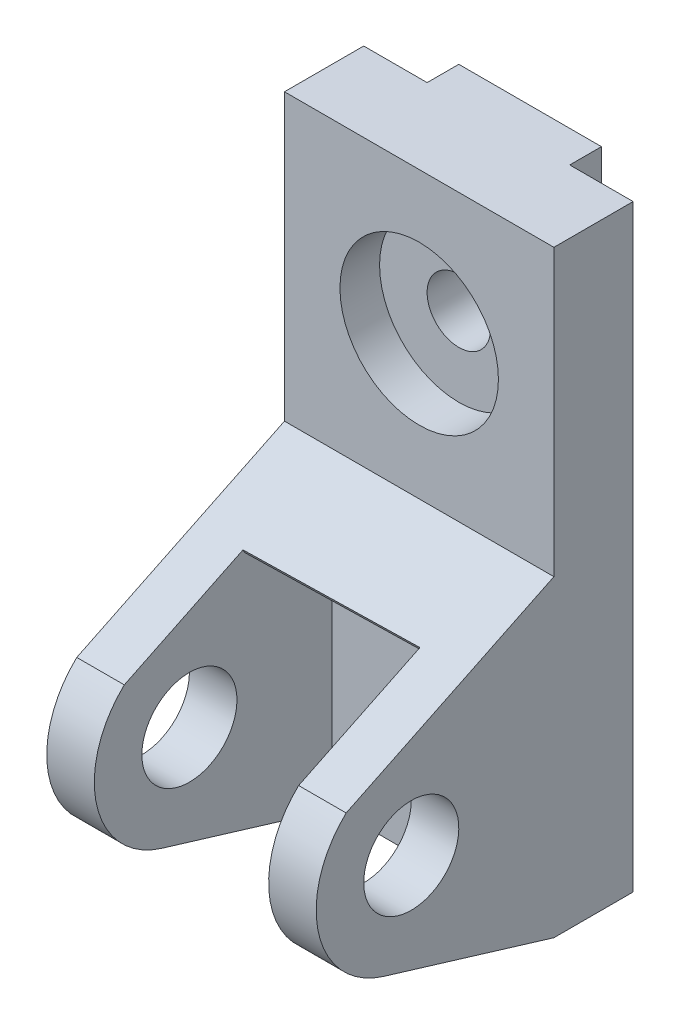
ISO-10303-21;
HEADER;
FILE_DESCRIPTION(('STEP AP214'),'2;1');
FILE_NAME('part.step','',(''),(''),'','','');
FILE_SCHEMA(('AUTOMOTIVE_DESIGN { 1 0 10303 214 1 1 1 1 }'));
ENDSEC;
DATA;
#1=APPLICATION_CONTEXT('core data for automotive mechanical design processes');
#2=APPLICATION_PROTOCOL_DEFINITION('international standard','automotive_design',2000,#1);
#3=PRODUCT_CONTEXT('',#1,'mechanical');
#4=PRODUCT('Part','Part','',(#3));
#5=PRODUCT_RELATED_PRODUCT_CATEGORY('part','',(#4));
#6=PRODUCT_DEFINITION_FORMATION('','',#4);
#7=PRODUCT_DEFINITION_CONTEXT('part definition',#1,'design');
#8=PRODUCT_DEFINITION('design','',#6,#7);
#9=PRODUCT_DEFINITION_SHAPE('','',#8);
#10=(LENGTH_UNIT() NAMED_UNIT(*) SI_UNIT(.MILLI.,.METRE.));
#11=(NAMED_UNIT(*) PLANE_ANGLE_UNIT() SI_UNIT($,.RADIAN.));
#12=(NAMED_UNIT(*) SI_UNIT($,.STERADIAN.) SOLID_ANGLE_UNIT());
#13=UNCERTAINTY_MEASURE_WITH_UNIT(LENGTH_MEASURE(1.E-05),#10,'distance_accuracy_value','');
#14=(GEOMETRIC_REPRESENTATION_CONTEXT(3) GLOBAL_UNCERTAINTY_ASSIGNED_CONTEXT((#13)) GLOBAL_UNIT_ASSIGNED_CONTEXT((#10,
#11,#12)) REPRESENTATION_CONTEXT('',''));
#15=CARTESIAN_POINT('',(0.,0.,0.));
#16=DIRECTION('',(0.,0.,1.));
#17=DIRECTION('',(1.,0.,0.));
#18=AXIS2_PLACEMENT_3D('',#15,#16,#17);
#19=CARTESIAN_POINT('',(-7.65235457063711,0.,-25.));
#20=DIRECTION('',(0.,0.,1.));
#21=DIRECTION('',(1.,0.,0.));
#22=AXIS2_PLACEMENT_3D('',#19,#20,#21);
#23=CYLINDRICAL_SURFACE('',#22,10.);
#24=CARTESIAN_POINT('',(-7.65235457063711,0.,-25.));
#25=DIRECTION('',(0.,0.,1.));
#26=DIRECTION('',(1.,0.,0.));
#27=AXIS2_PLACEMENT_3D('',#24,#25,#26);
#28=CIRCLE('',#27,10.);
#29=CARTESIAN_POINT('',(2.34764542936289,0.,-25.));
#30=VERTEX_POINT('',#29);
#31=EDGE_CURVE('E43',#30,#30,#28,.T.);
#32=ORIENTED_EDGE('',*,*,#31,.F.);
#33=EDGE_LOOP('',(#32));
#34=FACE_BOUND('',#33,.T.);
#35=CARTESIAN_POINT('',(-7.65235457063711,0.,-12.5));
#36=DIRECTION('',(0.,0.,1.));
#37=DIRECTION('',(1.,0.,0.));
#38=AXIS2_PLACEMENT_3D('',#35,#36,#37);
#39=CIRCLE('',#38,10.);
#40=CARTESIAN_POINT('',(2.34764542936289,0.,-12.5));
#41=VERTEX_POINT('',#40);
#42=EDGE_CURVE('E82',#41,#41,#39,.T.);
#43=ORIENTED_EDGE('',*,*,#42,.T.);
#44=EDGE_LOOP('',(#43));
#45=FACE_BOUND('',#44,.T.);
#46=ADVANCED_FACE('F39',(#34,#45),#23,.F.);
#47=CARTESIAN_POINT('',(0.,0.,-12.5));
#48=DIRECTION('',(0.,0.,1.));
#49=DIRECTION('',(1.,0.,0.));
#50=AXIS2_PLACEMENT_3D('',#47,#48,#49);
#51=PLANE('',#50);
#52=ORIENTED_EDGE('',*,*,#42,.F.);
#53=EDGE_LOOP('',(#52));
#54=FACE_BOUND('',#53,.T.);
#55=CARTESIAN_POINT('',(-7.65235457063711,0.,-12.5));
#56=DIRECTION('',(0.,0.,1.));
#57=DIRECTION('',(1.,0.,0.));
#58=AXIS2_PLACEMENT_3D('',#55,#56,#57);
#59=CIRCLE('',#58,25.);
#60=CARTESIAN_POINT('',(17.3476454293629,0.,-12.5));
#61=VERTEX_POINT('',#60);
#62=EDGE_CURVE('E372',#61,#61,#59,.T.);
#63=ORIENTED_EDGE('',*,*,#62,.T.);
#64=EDGE_LOOP('',(#63));
#65=FACE_BOUND('',#64,.T.);
#66=ADVANCED_FACE('F112',(#54,#65),#51,.T.);
#67=CARTESIAN_POINT('',(14.8476454293629,-143.145429362881,-25.));
#68=DIRECTION('',(0.,0.,1.));
#69=DIRECTION('',(1.,0.,0.));
#70=AXIS2_PLACEMENT_3D('',#67,#68,#69);
#71=PLANE('',#70);
#72=ORIENTED_EDGE('',*,*,#31,.T.);
#73=EDGE_LOOP('',(#72));
#74=FACE_BOUND('',#73,.T.);
#75=ADVANCED_FACE('F109',(#74),#71,.T.);
#76=CARTESIAN_POINT('',(0.,0.,0.));
#77=DIRECTION('',(0.,0.,1.));
#78=DIRECTION('',(1.,0.,0.));
#79=AXIS2_PLACEMENT_3D('',#76,#77,#78);
#80=PLANE('',#79);
#81=CARTESIAN_POINT('',(-7.65235457063711,0.,0.));
#82=DIRECTION('',(0.,0.,1.));
#83=DIRECTION('',(1.,0.,0.));
#84=AXIS2_PLACEMENT_3D('',#81,#82,#83);
#85=CIRCLE('',#84,25.);
#86=CARTESIAN_POINT('',(17.3476454293629,0.,0.));
#87=VERTEX_POINT('',#86);
#88=EDGE_CURVE('E326',#87,#87,#85,.T.);
#89=ORIENTED_EDGE('',*,*,#88,.F.);
#90=EDGE_LOOP('',(#89));
#91=FACE_BOUND('',#90,.T.);
#92=DIRECTION('',(0.,1.,0.));
#93=VECTOR('',#92,1.);
#94=CARTESIAN_POINT('',(-50.1523545706371,0.,0.));
#95=LINE('',#94,#93);
#96=CARTESIAN_POINT('',(-50.1523545706371,-45.1454293628809,0.));
#97=VERTEX_POINT('',#96);
#98=CARTESIAN_POINT('',(-50.1523545706371,44.8545706371191,0.));
#99=VERTEX_POINT('',#98);
#100=EDGE_CURVE('E339',#97,#99,#95,.T.);
#101=ORIENTED_EDGE('',*,*,#100,.F.);
#102=DIRECTION('',(-1.,0.,0.));
#103=VECTOR('',#102,1.);
#104=CARTESIAN_POINT('',(0.,-45.1454293628809,0.));
#105=LINE('',#104,#103);
#106=CARTESIAN_POINT('',(34.8476454293629,-45.1454293628809,0.));
#107=VERTEX_POINT('',#106);
#108=EDGE_CURVE('E348',#107,#97,#105,.T.);
#109=ORIENTED_EDGE('',*,*,#108,.F.);
#110=DIRECTION('',(0.,-1.,0.));
#111=VECTOR('',#110,1.);
#112=CARTESIAN_POINT('',(34.8476454293629,0.,0.));
#113=LINE('',#112,#111);
#114=CARTESIAN_POINT('',(34.8476454293629,44.8545706371191,0.));
#115=VERTEX_POINT('',#114);
#116=EDGE_CURVE('E351',#115,#107,#113,.T.);
#117=ORIENTED_EDGE('',*,*,#116,.F.);
#118=DIRECTION('',(1.,0.,0.));
#119=VECTOR('',#118,1.);
#120=CARTESIAN_POINT('',(0.,44.8545706371191,0.));
#121=LINE('',#120,#119);
#122=EDGE_CURVE('E354',#99,#115,#121,.T.);
#123=ORIENTED_EDGE('',*,*,#122,.F.);
#124=EDGE_LOOP('',(#101,#109,#117,#123));
#125=FACE_BOUND('',#124,.T.);
#126=ADVANCED_FACE('F121',(#91,#125),#80,.T.);
#127=DIRECTION('',(1.,0.,0.));
#128=VECTOR('',#127,1.);
#129=CARTESIAN_POINT('',(0.,-46.2568685076262,0.));
#130=LINE('',#129,#128);
#131=CARTESIAN_POINT('',(-35.1523545706371,-46.2568685076262,0.));
#132=VERTEX_POINT('',#131);
#133=CARTESIAN_POINT('',(19.8476454293629,-46.2568685076262,0.));
#134=VERTEX_POINT('',#133);
#135=EDGE_CURVE('E216',#132,#134,#130,.T.);
#136=ORIENTED_EDGE('',*,*,#135,.F.);
#137=DIRECTION('',(0.,1.,0.));
#138=VECTOR('',#137,1.);
#139=CARTESIAN_POINT('',(-35.1523545706371,-45.1454293628809,0.));
#140=LINE('',#139,#138);
#141=CARTESIAN_POINT('',(-35.1523545706371,-143.145429362881,0.));
#142=VERTEX_POINT('',#141);
#143=EDGE_CURVE('E243',#142,#132,#140,.T.);
#144=ORIENTED_EDGE('',*,*,#143,.F.);
#145=DIRECTION('',(-1.,0.,0.));
#146=VECTOR('',#145,1.);
#147=CARTESIAN_POINT('',(-50.1523545706371,-143.145429362881,0.));
#148=LINE('',#147,#146);
#149=CARTESIAN_POINT('',(19.8476454293629,-143.145429362881,0.));
#150=VERTEX_POINT('',#149);
#151=EDGE_CURVE('E283',#150,#142,#148,.T.);
#152=ORIENTED_EDGE('',*,*,#151,.F.);
#153=DIRECTION('',(0.,1.,0.));
#154=VECTOR('',#153,1.);
#155=CARTESIAN_POINT('',(19.8476454293629,0.,0.));
#156=LINE('',#155,#154);
#157=EDGE_CURVE('E367',#150,#134,#156,.T.);
#158=ORIENTED_EDGE('',*,*,#157,.T.);
#159=EDGE_LOOP('',(#136,#144,#152,#158));
#160=FACE_BOUND('',#159,.T.);
#161=ADVANCED_FACE('F150',(#160),#80,.T.);
#162=CARTESIAN_POINT('',(19.8476454293629,0.,0.));
#163=DIRECTION('',(1.,0.,0.));
#164=DIRECTION('',(0.,1.,0.));
#165=AXIS2_PLACEMENT_3D('',#162,#163,#164);
#166=PLANE('',#165);
#167=CARTESIAN_POINT('',(19.8476454293629,-98.8027621053321,45.));
#168=DIRECTION('',(1.,0.,0.));
#169=DIRECTION('',(0.,1.,0.));
#170=AXIS2_PLACEMENT_3D('',#167,#168,#169);
#171=CIRCLE('',#170,15.);
#172=CARTESIAN_POINT('',(19.8476454293629,-83.8027621053321,45.));
#173=VERTEX_POINT('',#172);
#174=EDGE_CURVE('E290',#173,#173,#171,.T.);
#175=ORIENTED_EDGE('',*,*,#174,.T.);
#176=EDGE_LOOP('',(#175));
#177=FACE_BOUND('',#176,.T.);
#178=DIRECTION('',(0.,-0.436437923788703,0.899734371177964));
#179=VECTOR('',#178,1.);
#180=CARTESIAN_POINT('',(19.8476454293629,-36.5462155003355,-17.7276259818978));
#181=LINE('',#180,#179);
#182=CARTESIAN_POINT('',(19.8476454293629,-58.3726068665543,27.2683595651249));
#183=VERTEX_POINT('',#182);
#184=CARTESIAN_POINT('',(19.8476454293629,-76.9373199425125,65.5402638499214));
#185=VERTEX_POINT('',#184);
#186=EDGE_CURVE('E293',#183,#185,#181,.T.);
#187=ORIENTED_EDGE('',*,*,#186,.F.);
#188=DIRECTION('',(0.,-0.899734371177964,-0.436437923788703));
#189=VECTOR('',#188,1.);
#190=CARTESIAN_POINT('',(19.8476454293629,-21.8263913662188,44.9959855470227));
#191=LINE('',#190,#189);
#192=CARTESIAN_POINT('',(19.8476454293629,-59.2723412377323,26.8319216413362));
#193=VERTEX_POINT('',#192);
#194=EDGE_CURVE('E228',#183,#193,#191,.T.);
#195=ORIENTED_EDGE('',*,*,#194,.T.);
#196=DIRECTION('',(0.,0.436437923788703,-0.899734371177964));
#197=VECTOR('',#196,1.);
#198=CARTESIAN_POINT('',(19.8476454293629,-37.4459498715134,-18.1640639056865));
#199=LINE('',#198,#197);
#200=EDGE_CURVE('E209',#193,#134,#199,.T.);
#201=ORIENTED_EDGE('',*,*,#200,.T.);
#202=ORIENTED_EDGE('',*,*,#157,.F.);
#203=DIRECTION('',(0.,0.,1.));
#204=VECTOR('',#203,1.);
#205=CARTESIAN_POINT('',(19.8476454293629,-143.145429362881,0.));
#206=LINE('',#205,#204);
#207=CARTESIAN_POINT('',(19.8476454293629,-143.145429362881,-25.));
#208=VERTEX_POINT('',#207);
#209=EDGE_CURVE('E362',#208,#150,#206,.T.);
#210=ORIENTED_EDGE('',*,*,#209,.F.);
#211=DIRECTION('',(0.,-1.,0.));
#212=VECTOR('',#211,1.);
#213=CARTESIAN_POINT('',(19.8476454293629,0.,-25.));
#214=LINE('',#213,#212);
#215=CARTESIAN_POINT('',(19.8476454293629,-143.802762105332,-25.));
#216=VERTEX_POINT('',#215);
#217=EDGE_CURVE('E306',#208,#216,#214,.T.);
#218=ORIENTED_EDGE('',*,*,#217,.T.);
#219=DIRECTION('',(0.,0.,1.));
#220=VECTOR('',#219,1.);
#221=CARTESIAN_POINT('',(19.8476454293629,-143.802762105332,0.));
#222=LINE('',#221,#220);
#223=CARTESIAN_POINT('',(19.8476454293629,-143.802762105332,0.));
#224=VERTEX_POINT('',#223);
#225=EDGE_CURVE('E303',#216,#224,#222,.T.);
#226=ORIENTED_EDGE('',*,*,#225,.T.);
#227=DIRECTION('',(0.,-0.290276231128989,-0.956942897795657));
#228=VECTOR('',#227,1.);
#229=CARTESIAN_POINT('',(19.8476454293629,-131.68589961599,39.9452116959255));
#230=LINE('',#229,#228);
#231=CARTESIAN_POINT('',(19.8476454293629,-127.511049039202,53.7082869338697));
#232=VERTEX_POINT('',#231);
#233=EDGE_CURVE('E300',#232,#224,#230,.T.);
#234=ORIENTED_EDGE('',*,*,#233,.F.);
#235=CARTESIAN_POINT('',(19.8476454293629,-98.8027621053321,45.));
#236=DIRECTION('',(1.,0.,0.));
#237=DIRECTION('',(0.,1.,0.));
#238=AXIS2_PLACEMENT_3D('',#235,#236,#237);
#239=CIRCLE('',#238,30.);
#240=EDGE_CURVE('E297',#185,#232,#239,.T.);
#241=ORIENTED_EDGE('',*,*,#240,.F.);
#242=EDGE_LOOP('',(#187,#195,#201,#202,#210,#218,#226,#234,#241));
#243=FACE_BOUND('',#242,.T.);
#244=ADVANCED_FACE('F148',(#177,#243),#166,.F.);
#245=CARTESIAN_POINT('',(-50.1523545706371,0.,-25.));
#246=DIRECTION('',(1.,0.,0.));
#247=DIRECTION('',(0.,0.,-1.));
#248=AXIS2_PLACEMENT_3D('',#245,#246,#247);
#249=PLANE('',#248);
#250=DIRECTION('',(0.,-0.436437923788703,0.899734371177964));
#251=VECTOR('',#250,1.);
#252=CARTESIAN_POINT('',(-50.1523545706371,-36.5462155003355,-17.7276259818978));
#253=LINE('',#252,#251);
#254=CARTESIAN_POINT('',(-50.1523545706371,-76.9373199425125,65.5402638499214));
#255=VERTEX_POINT('',#254);
#256=EDGE_CURVE('E262',#97,#255,#253,.T.);
#257=ORIENTED_EDGE('',*,*,#256,.F.);
#258=ORIENTED_EDGE('',*,*,#100,.T.);
#259=DIRECTION('',(0.,0.,1.));
#260=VECTOR('',#259,1.);
#261=CARTESIAN_POINT('',(-50.1523545706371,44.8545706371191,-25.));
#262=LINE('',#261,#260);
#263=CARTESIAN_POINT('',(-50.1523545706371,44.8545706371191,-25.));
#264=VERTEX_POINT('',#263);
#265=EDGE_CURVE('E359',#264,#99,#262,.T.);
#266=ORIENTED_EDGE('',*,*,#265,.F.);
#267=DIRECTION('',(0.,1.,0.));
#268=VECTOR('',#267,1.);
#269=CARTESIAN_POINT('',(-50.1523545706371,0.,-25.));
#270=LINE('',#269,#268);
#271=CARTESIAN_POINT('',(-50.1523545706371,-143.145429362881,-25.));
#272=VERTEX_POINT('',#271);
#273=EDGE_CURVE('E342',#272,#264,#270,.T.);
#274=ORIENTED_EDGE('',*,*,#273,.F.);
#275=DIRECTION('',(0.,0.,-1.));
#276=VECTOR('',#275,1.);
#277=CARTESIAN_POINT('',(-50.1523545706371,-143.145429362881,-25.));
#278=LINE('',#277,#276);
#279=CARTESIAN_POINT('',(-50.1523545706371,-143.145429362881,0.));
#280=VERTEX_POINT('',#279);
#281=EDGE_CURVE('E286',#280,#272,#278,.T.);
#282=ORIENTED_EDGE('',*,*,#281,.F.);
#283=DIRECTION('',(0.,1.,0.));
#284=VECTOR('',#283,1.);
#285=CARTESIAN_POINT('',(-50.1523545706371,-45.1454293628809,0.));
#286=LINE('',#285,#284);
#287=CARTESIAN_POINT('',(-50.1523545706371,-143.802762105332,0.));
#288=VERTEX_POINT('',#287);
#289=EDGE_CURVE('E222',#288,#280,#286,.T.);
#290=ORIENTED_EDGE('',*,*,#289,.F.);
#291=DIRECTION('',(0.,-0.290276231128989,-0.956942897795657));
#292=VECTOR('',#291,1.);
#293=CARTESIAN_POINT('',(-50.1523545706371,-131.68589961599,39.9452116959255));
#294=LINE('',#293,#292);
#295=CARTESIAN_POINT('',(-50.1523545706371,-127.511049039202,53.7082869338697));
#296=VERTEX_POINT('',#295);
#297=EDGE_CURVE('E250',#296,#288,#294,.T.);
#298=ORIENTED_EDGE('',*,*,#297,.F.);
#299=CARTESIAN_POINT('',(-50.1523545706371,-98.8027621053321,45.));
#300=DIRECTION('',(1.,0.,0.));
#301=DIRECTION('',(0.,1.,0.));
#302=AXIS2_PLACEMENT_3D('',#299,#300,#301);
#303=CIRCLE('',#302,30.);
#304=EDGE_CURVE('E265',#255,#296,#303,.T.);
#305=ORIENTED_EDGE('',*,*,#304,.F.);
#306=EDGE_LOOP('',(#257,#258,#266,#274,#282,#290,#298,#305));
#307=FACE_BOUND('',#306,.T.);
#308=CARTESIAN_POINT('',(-50.1523545706371,-98.8027621053321,45.));
#309=DIRECTION('',(1.,0.,0.));
#310=DIRECTION('',(0.,1.,0.));
#311=AXIS2_PLACEMENT_3D('',#308,#309,#310);
#312=CIRCLE('',#311,15.);
#313=CARTESIAN_POINT('',(-50.1523545706371,-83.8027621053321,45.));
#314=VERTEX_POINT('',#313);
#315=EDGE_CURVE('E242',#314,#314,#312,.T.);
#316=ORIENTED_EDGE('',*,*,#315,.T.);
#317=EDGE_LOOP('',(#316));
#318=FACE_BOUND('',#317,.T.);
#319=ADVANCED_FACE('F140',(#307,#318),#249,.F.);
#320=CARTESIAN_POINT('',(-7.65235457063711,0.,-25.));
#321=DIRECTION('',(0.,0.,1.));
#322=DIRECTION('',(1.,0.,0.));
#323=AXIS2_PLACEMENT_3D('',#320,#321,#322);
#324=CYLINDRICAL_SURFACE('',#323,25.);
#325=ORIENTED_EDGE('',*,*,#62,.F.);
#326=EDGE_LOOP('',(#325));
#327=FACE_BOUND('',#326,.T.);
#328=ORIENTED_EDGE('',*,*,#88,.T.);
#329=EDGE_LOOP('',(#328));
#330=FACE_BOUND('',#329,.T.);
#331=ADVANCED_FACE('F136',(#327,#330),#324,.F.);
#332=CARTESIAN_POINT('',(34.8476454293629,0.,-25.));
#333=DIRECTION('',(-1.,0.,0.));
#334=DIRECTION('',(0.,-1.,0.));
#335=AXIS2_PLACEMENT_3D('',#332,#333,#334);
#336=PLANE('',#335);
#337=DIRECTION('',(0.,-0.436437923788703,0.899734371177964));
#338=VECTOR('',#337,1.);
#339=CARTESIAN_POINT('',(34.8476454293629,-36.5462155003355,-17.7276259818978));
#340=LINE('',#339,#338);
#341=CARTESIAN_POINT('',(34.8476454293629,-76.9373199425125,65.5402638499214));
#342=VERTEX_POINT('',#341);
#343=EDGE_CURVE('E312',#107,#342,#340,.T.);
#344=ORIENTED_EDGE('',*,*,#343,.T.);
#345=CARTESIAN_POINT('',(34.8476454293629,-98.8027621053321,45.));
#346=DIRECTION('',(1.,0.,0.));
#347=DIRECTION('',(0.,1.,0.));
#348=AXIS2_PLACEMENT_3D('',#345,#346,#347);
#349=CIRCLE('',#348,30.);
#350=CARTESIAN_POINT('',(34.8476454293629,-127.511049039202,53.7082869338697));
#351=VERTEX_POINT('',#350);
#352=EDGE_CURVE('E315',#342,#351,#349,.T.);
#353=ORIENTED_EDGE('',*,*,#352,.T.);
#354=DIRECTION('',(0.,-0.290276231128989,-0.956942897795657));
#355=VECTOR('',#354,1.);
#356=CARTESIAN_POINT('',(34.8476454293629,-131.68589961599,39.9452116959255));
#357=LINE('',#356,#355);
#358=CARTESIAN_POINT('',(34.8476454293629,-143.802762105332,0.));
#359=VERTEX_POINT('',#358);
#360=EDGE_CURVE('E318',#351,#359,#357,.T.);
#361=ORIENTED_EDGE('',*,*,#360,.T.);
#362=DIRECTION('',(0.,0.,1.));
#363=VECTOR('',#362,1.);
#364=CARTESIAN_POINT('',(34.8476454293629,-143.802762105332,0.));
#365=LINE('',#364,#363);
#366=CARTESIAN_POINT('',(34.8476454293629,-143.802762105332,-25.));
#367=VERTEX_POINT('',#366);
#368=EDGE_CURVE('E294',#367,#359,#365,.T.);
#369=ORIENTED_EDGE('',*,*,#368,.F.);
#370=DIRECTION('',(0.,-1.,0.));
#371=VECTOR('',#370,1.);
#372=CARTESIAN_POINT('',(34.8476454293629,0.,-25.));
#373=LINE('',#372,#371);
#374=CARTESIAN_POINT('',(34.8476454293629,44.8545706371191,-25.));
#375=VERTEX_POINT('',#374);
#376=EDGE_CURVE('E335',#375,#367,#373,.T.);
#377=ORIENTED_EDGE('',*,*,#376,.F.);
#378=DIRECTION('',(0.,0.,1.));
#379=VECTOR('',#378,1.);
#380=CARTESIAN_POINT('',(34.8476454293629,44.8545706371191,-25.));
#381=LINE('',#380,#379);
#382=EDGE_CURVE('E345',#375,#115,#381,.T.);
#383=ORIENTED_EDGE('',*,*,#382,.T.);
#384=ORIENTED_EDGE('',*,*,#116,.T.);
#385=EDGE_LOOP('',(#344,#353,#361,#369,#377,#383,#384));
#386=FACE_BOUND('',#385,.T.);
#387=CARTESIAN_POINT('',(34.8476454293629,-98.8027621053321,45.));
#388=DIRECTION('',(1.,0.,0.));
#389=DIRECTION('',(0.,1.,0.));
#390=AXIS2_PLACEMENT_3D('',#387,#388,#389);
#391=CIRCLE('',#390,15.);
#392=CARTESIAN_POINT('',(34.8476454293629,-83.8027621053321,45.));
#393=VERTEX_POINT('',#392);
#394=EDGE_CURVE('E289',#393,#393,#391,.T.);
#395=ORIENTED_EDGE('',*,*,#394,.F.);
#396=EDGE_LOOP('',(#395));
#397=FACE_BOUND('',#396,.T.);
#398=ADVANCED_FACE('F139',(#386,#397),#336,.F.);
#399=CARTESIAN_POINT('',(19.8476454293629,-36.5462155003355,-17.7276259818978));
#400=DIRECTION('',(0.,0.899734371177964,0.436437923788703));
#401=DIRECTION('',(0.,-0.436437923788703,0.899734371177964));
#402=AXIS2_PLACEMENT_3D('',#399,#400,#401);
#403=PLANE('',#402);
#404=DIRECTION('',(1.,0.,0.));
#405=VECTOR('',#404,1.);
#406=CARTESIAN_POINT('',(19.8476454293629,-76.9373199425125,65.5402638499214));
#407=LINE('',#406,#405);
#408=EDGE_CURVE('E309',#185,#342,#407,.T.);
#409=ORIENTED_EDGE('',*,*,#408,.T.);
#410=ORIENTED_EDGE('',*,*,#343,.F.);
#411=ORIENTED_EDGE('',*,*,#108,.T.);
#412=ORIENTED_EDGE('',*,*,#256,.T.);
#413=DIRECTION('',(-1.,0.,0.));
#414=VECTOR('',#413,1.);
#415=CARTESIAN_POINT('',(-35.1523545706371,-76.9373199425125,65.5402638499214));
#416=LINE('',#415,#414);
#417=CARTESIAN_POINT('',(-35.1523545706371,-76.9373199425125,65.5402638499214));
#418=VERTEX_POINT('',#417);
#419=EDGE_CURVE('E259',#418,#255,#416,.T.);
#420=ORIENTED_EDGE('',*,*,#419,.F.);
#421=DIRECTION('',(0.,-0.436437923788703,0.899734371177964));
#422=VECTOR('',#421,1.);
#423=CARTESIAN_POINT('',(-35.1523545706371,-36.5462155003355,-17.7276259818978));
#424=LINE('',#423,#422);
#425=CARTESIAN_POINT('',(-35.1523545706371,-58.7718459329056,28.0914069923396));
#426=VERTEX_POINT('',#425);
#427=EDGE_CURVE('E249',#426,#418,#424,.T.);
#428=ORIENTED_EDGE('',*,*,#427,.F.);
#429=DIRECTION('',(0.999861714821782,0.00725788831828757,-0.0149624293082647));
#430=VECTOR('',#429,1.);
#431=CARTESIAN_POINT('',(-50.1523545706371,-58.8807293146377,28.3158744724891));
#432=LINE('',#431,#430);
#433=EDGE_CURVE('E232',#426,#183,#432,.T.);
#434=ORIENTED_EDGE('',*,*,#433,.T.);
#435=ORIENTED_EDGE('',*,*,#186,.T.);
#436=EDGE_LOOP('',(#409,#410,#411,#412,#420,#428,#434,#435));
#437=FACE_BOUND('',#436,.T.);
#438=ADVANCED_FACE('F144',(#437),#403,.T.);
#439=CARTESIAN_POINT('',(19.8476454293629,-143.802762105332,0.));
#440=DIRECTION('',(0.,1.,0.));
#441=DIRECTION('',(-1.,0.,0.));
#442=AXIS2_PLACEMENT_3D('',#439,#440,#441);
#443=PLANE('',#442);
#444=ORIENTED_EDGE('',*,*,#368,.T.);
#445=DIRECTION('',(1.,0.,0.));
#446=VECTOR('',#445,1.);
#447=CARTESIAN_POINT('',(19.8476454293629,-143.802762105332,0.));
#448=LINE('',#447,#446);
#449=EDGE_CURVE('E327',#224,#359,#448,.T.);
#450=ORIENTED_EDGE('',*,*,#449,.F.);
#451=ORIENTED_EDGE('',*,*,#225,.F.);
#452=DIRECTION('',(1.,0.,0.));
#453=VECTOR('',#452,1.);
#454=CARTESIAN_POINT('',(19.8476454293629,-143.802762105332,-25.));
#455=LINE('',#454,#453);
#456=EDGE_CURVE('E323',#216,#367,#455,.T.);
#457=ORIENTED_EDGE('',*,*,#456,.T.);
#458=EDGE_LOOP('',(#444,#450,#451,#457));
#459=FACE_BOUND('',#458,.T.);
#460=ADVANCED_FACE('F162',(#459),#443,.F.);
#461=CARTESIAN_POINT('',(19.8476454293629,-131.68589961599,39.9452116959255));
#462=DIRECTION('',(0.,-0.956942897795657,0.290276231128989));
#463=DIRECTION('',(0.,-0.290276231128989,-0.956942897795657));
#464=AXIS2_PLACEMENT_3D('',#461,#462,#463);
#465=PLANE('',#464);
#466=ORIENTED_EDGE('',*,*,#360,.F.);
#467=DIRECTION('',(1.,0.,0.));
#468=VECTOR('',#467,1.);
#469=CARTESIAN_POINT('',(19.8476454293629,-127.511049039202,53.7082869338697));
#470=LINE('',#469,#468);
#471=EDGE_CURVE('E330',#232,#351,#470,.T.);
#472=ORIENTED_EDGE('',*,*,#471,.F.);
#473=ORIENTED_EDGE('',*,*,#233,.T.);
#474=ORIENTED_EDGE('',*,*,#449,.T.);
#475=EDGE_LOOP('',(#466,#472,#473,#474));
#476=FACE_BOUND('',#475,.T.);
#477=ADVANCED_FACE('F158',(#476),#465,.T.);
#478=CARTESIAN_POINT('',(19.8476454293629,-98.8027621053321,45.));
#479=DIRECTION('',(1.,0.,0.));
#480=DIRECTION('',(0.,1.,0.));
#481=AXIS2_PLACEMENT_3D('',#478,#479,#480);
#482=CYLINDRICAL_SURFACE('',#481,15.);
#483=ORIENTED_EDGE('',*,*,#174,.F.);
#484=EDGE_LOOP('',(#483));
#485=FACE_BOUND('',#484,.T.);
#486=ORIENTED_EDGE('',*,*,#394,.T.);
#487=EDGE_LOOP('',(#486));
#488=FACE_BOUND('',#487,.T.);
#489=ADVANCED_FACE('F154',(#485,#488),#482,.F.);
#490=CARTESIAN_POINT('',(19.8476454293629,-98.8027621053321,45.));
#491=DIRECTION('',(1.,0.,0.));
#492=DIRECTION('',(0.,1.,0.));
#493=AXIS2_PLACEMENT_3D('',#490,#491,#492);
#494=CYLINDRICAL_SURFACE('',#493,30.);
#495=ORIENTED_EDGE('',*,*,#352,.F.);
#496=ORIENTED_EDGE('',*,*,#408,.F.);
#497=ORIENTED_EDGE('',*,*,#240,.T.);
#498=ORIENTED_EDGE('',*,*,#471,.T.);
#499=EDGE_LOOP('',(#495,#496,#497,#498));
#500=FACE_BOUND('',#499,.T.);
#501=ADVANCED_FACE('F157',(#500),#494,.T.);
#502=CARTESIAN_POINT('',(-35.1523545706371,-45.1454293628809,0.));
#503=DIRECTION('',(0.,0.,1.));
#504=DIRECTION('',(0.,-1.,0.));
#505=AXIS2_PLACEMENT_3D('',#502,#503,#504);
#506=PLANE('',#505);
#507=ORIENTED_EDGE('',*,*,#289,.T.);
#508=EDGE_CURVE('E282',#142,#280,#148,.T.);
#509=ORIENTED_EDGE('',*,*,#508,.F.);
#510=CARTESIAN_POINT('',(-35.1523545706371,-143.802762105332,0.));
#511=VERTEX_POINT('',#510);
#512=EDGE_CURVE('E239',#511,#142,#140,.T.);
#513=ORIENTED_EDGE('',*,*,#512,.F.);
#514=DIRECTION('',(-1.,0.,0.));
#515=VECTOR('',#514,1.);
#516=CARTESIAN_POINT('',(-35.1523545706371,-143.802762105332,0.));
#517=LINE('',#516,#515);
#518=EDGE_CURVE('E270',#511,#288,#517,.T.);
#519=ORIENTED_EDGE('',*,*,#518,.T.);
#520=EDGE_LOOP('',(#507,#509,#513,#519));
#521=FACE_BOUND('',#520,.T.);
#522=ADVANCED_FACE('F166',(#521),#506,.F.);
#523=CARTESIAN_POINT('',(-35.1523545706371,-98.8027621053321,45.));
#524=DIRECTION('',(-1.,0.,0.));
#525=DIRECTION('',(0.,1.,0.));
#526=AXIS2_PLACEMENT_3D('',#523,#524,#525);
#527=CYLINDRICAL_SURFACE('',#526,30.);
#528=ORIENTED_EDGE('',*,*,#304,.T.);
#529=DIRECTION('',(-1.,0.,0.));
#530=VECTOR('',#529,1.);
#531=CARTESIAN_POINT('',(-35.1523545706371,-127.511049039202,53.7082869338697));
#532=LINE('',#531,#530);
#533=CARTESIAN_POINT('',(-35.1523545706371,-127.511049039202,53.7082869338697));
#534=VERTEX_POINT('',#533);
#535=EDGE_CURVE('E274',#534,#296,#532,.T.);
#536=ORIENTED_EDGE('',*,*,#535,.F.);
#537=CARTESIAN_POINT('',(-35.1523545706371,-98.8027621053321,45.));
#538=DIRECTION('',(1.,0.,0.));
#539=DIRECTION('',(0.,1.,0.));
#540=AXIS2_PLACEMENT_3D('',#537,#538,#539);
#541=CIRCLE('',#540,30.);
#542=EDGE_CURVE('E253',#418,#534,#541,.T.);
#543=ORIENTED_EDGE('',*,*,#542,.F.);
#544=ORIENTED_EDGE('',*,*,#419,.T.);
#545=EDGE_LOOP('',(#528,#536,#543,#544));
#546=FACE_BOUND('',#545,.T.);
#547=ADVANCED_FACE('F181',(#546),#527,.T.);
#548=CARTESIAN_POINT('',(-35.1523545706371,-98.8027621053321,45.));
#549=DIRECTION('',(-1.,0.,0.));
#550=DIRECTION('',(0.,1.,0.));
#551=AXIS2_PLACEMENT_3D('',#548,#549,#550);
#552=CYLINDRICAL_SURFACE('',#551,15.);
#553=CARTESIAN_POINT('',(-35.1523545706371,-98.8027621053321,45.));
#554=DIRECTION('',(1.,0.,0.));
#555=DIRECTION('',(0.,1.,0.));
#556=AXIS2_PLACEMENT_3D('',#553,#554,#555);
#557=CIRCLE('',#556,15.);
#558=CARTESIAN_POINT('',(-35.1523545706371,-83.8027621053321,45.));
#559=VERTEX_POINT('',#558);
#560=EDGE_CURVE('E246',#559,#559,#557,.T.);
#561=ORIENTED_EDGE('',*,*,#560,.T.);
#562=EDGE_LOOP('',(#561));
#563=FACE_BOUND('',#562,.T.);
#564=ORIENTED_EDGE('',*,*,#315,.F.);
#565=EDGE_LOOP('',(#564));
#566=FACE_BOUND('',#565,.T.);
#567=ADVANCED_FACE('F177',(#563,#566),#552,.F.);
#568=CARTESIAN_POINT('',(-35.1523545706371,0.,0.));
#569=DIRECTION('',(-1.,0.,0.));
#570=DIRECTION('',(0.,1.,0.));
#571=AXIS2_PLACEMENT_3D('',#568,#569,#570);
#572=PLANE('',#571);
#573=ORIENTED_EDGE('',*,*,#560,.F.);
#574=EDGE_LOOP('',(#573));
#575=FACE_BOUND('',#574,.T.);
#576=DIRECTION('',(0.,-0.436437923788703,0.899734371177964));
#577=VECTOR('',#576,1.);
#578=CARTESIAN_POINT('',(-35.1523545706371,-37.4459498715134,-18.1640639056865));
#579=LINE('',#578,#577);
#580=CARTESIAN_POINT('',(-35.1523545706371,-59.6715803040835,27.6549690685509));
#581=VERTEX_POINT('',#580);
#582=EDGE_CURVE('E369',#132,#581,#579,.T.);
#583=ORIENTED_EDGE('',*,*,#582,.T.);
#584=DIRECTION('',(0.,0.899734371177964,0.436437923788703));
#585=VECTOR('',#584,1.);
#586=CARTESIAN_POINT('',(-35.1523545706371,-22.2256304325701,45.8190329742374));
#587=LINE('',#586,#585);
#588=EDGE_CURVE('E231',#581,#426,#587,.T.);
#589=ORIENTED_EDGE('',*,*,#588,.T.);
#590=ORIENTED_EDGE('',*,*,#427,.T.);
#591=ORIENTED_EDGE('',*,*,#542,.T.);
#592=DIRECTION('',(0.,-0.290276231128989,-0.956942897795657));
#593=VECTOR('',#592,1.);
#594=CARTESIAN_POINT('',(-35.1523545706371,-131.68589961599,39.9452116959255));
#595=LINE('',#594,#593);
#596=EDGE_CURVE('E256',#534,#511,#595,.T.);
#597=ORIENTED_EDGE('',*,*,#596,.T.);
#598=ORIENTED_EDGE('',*,*,#512,.T.);
#599=ORIENTED_EDGE('',*,*,#143,.T.);
#600=EDGE_LOOP('',(#583,#589,#590,#591,#597,#598,#599));
#601=FACE_BOUND('',#600,.T.);
#602=ADVANCED_FACE('F180',(#575,#601),#572,.F.);
#603=CARTESIAN_POINT('',(-35.1523545706371,-131.68589961599,39.9452116959255));
#604=DIRECTION('',(0.,-0.956942897795657,0.290276231128989));
#605=DIRECTION('',(0.,-0.290276231128989,-0.956942897795657));
#606=AXIS2_PLACEMENT_3D('',#603,#604,#605);
#607=PLANE('',#606);
#608=ORIENTED_EDGE('',*,*,#297,.T.);
#609=ORIENTED_EDGE('',*,*,#518,.F.);
#610=ORIENTED_EDGE('',*,*,#596,.F.);
#611=ORIENTED_EDGE('',*,*,#535,.T.);
#612=EDGE_LOOP('',(#608,#609,#610,#611));
#613=FACE_BOUND('',#612,.T.);
#614=ADVANCED_FACE('F186',(#613),#607,.T.);
#615=CARTESIAN_POINT('',(0.,-37.4459498715134,-18.1640639056865));
#616=DIRECTION('',(0.,-0.899734371177964,-0.436437923788703));
#617=DIRECTION('',(0.,0.436437923788703,-0.899734371177964));
#618=AXIS2_PLACEMENT_3D('',#615,#616,#617);
#619=PLANE('',#618);
#620=ORIENTED_EDGE('',*,*,#200,.F.);
#621=DIRECTION('',(0.999861714821782,0.00725788831828757,-0.0149624293082647));
#622=VECTOR('',#621,1.);
#623=CARTESIAN_POINT('',(-50.1523545706371,-59.7804636858157,27.8794365487004));
#624=LINE('',#623,#622);
#625=EDGE_CURVE('E213',#581,#193,#624,.T.);
#626=ORIENTED_EDGE('',*,*,#625,.F.);
#627=ORIENTED_EDGE('',*,*,#582,.F.);
#628=ORIENTED_EDGE('',*,*,#135,.T.);
#629=EDGE_LOOP('',(#620,#626,#627,#628));
#630=FACE_BOUND('',#629,.T.);
#631=ADVANCED_FACE('F189',(#630),#619,.T.);
#632=CARTESIAN_POINT('',(-50.1523545706371,-59.7804636858157,27.8794365487004));
#633=DIRECTION('',(0.01662982963369,-0.43637757089263,0.899609951250097));
#634=DIRECTION('',(0.,-0.899734371177964,-0.436437923788703));
#635=AXIS2_PLACEMENT_3D('',#632,#633,#634);
#636=PLANE('',#635);
#637=ORIENTED_EDGE('',*,*,#194,.F.);
#638=ORIENTED_EDGE('',*,*,#433,.F.);
#639=ORIENTED_EDGE('',*,*,#588,.F.);
#640=ORIENTED_EDGE('',*,*,#625,.T.);
#641=EDGE_LOOP('',(#637,#638,#639,#640));
#642=FACE_BOUND('',#641,.T.);
#643=ADVANCED_FACE('F128',(#642),#636,.T.);
#644=CARTESIAN_POINT('',(-30.1523545706371,-143.145429362881,-35.));
#645=DIRECTION('',(0.,0.,-1.));
#646=DIRECTION('',(-1.,0.,0.));
#647=AXIS2_PLACEMENT_3D('',#644,#645,#646);
#648=PLANE('',#647);
#649=DIRECTION('',(-1.,0.,0.));
#650=VECTOR('',#649,1.);
#651=CARTESIAN_POINT('',(-30.1523545706371,44.8545706371191,-35.));
#652=LINE('',#651,#650);
#653=CARTESIAN_POINT('',(14.8476454293629,44.8545706371191,-35.));
#654=VERTEX_POINT('',#653);
#655=CARTESIAN_POINT('',(-30.1523545706371,44.8545706371191,-35.));
#656=VERTEX_POINT('',#655);
#657=EDGE_CURVE('E77',#654,#656,#652,.T.);
#658=ORIENTED_EDGE('',*,*,#657,.F.);
#659=DIRECTION('',(0.,1.,0.));
#660=VECTOR('',#659,1.);
#661=CARTESIAN_POINT('',(14.8476454293629,-143.145429362881,-35.));
#662=LINE('',#661,#660);
#663=CARTESIAN_POINT('',(14.8476454293629,-143.145429362881,-35.));
#664=VERTEX_POINT('',#663);
#665=EDGE_CURVE('E72',#664,#654,#662,.T.);
#666=ORIENTED_EDGE('',*,*,#665,.F.);
#667=DIRECTION('',(-1.,0.,0.));
#668=VECTOR('',#667,1.);
#669=CARTESIAN_POINT('',(-30.1523545706371,-143.145429362881,-35.));
#670=LINE('',#669,#668);
#671=CARTESIAN_POINT('',(-30.1523545706371,-143.145429362881,-35.));
#672=VERTEX_POINT('',#671);
#673=EDGE_CURVE('E80',#664,#672,#670,.T.);
#674=ORIENTED_EDGE('',*,*,#673,.T.);
#675=DIRECTION('',(0.,1.,0.));
#676=VECTOR('',#675,1.);
#677=CARTESIAN_POINT('',(-30.1523545706371,-143.145429362881,-35.));
#678=LINE('',#677,#676);
#679=EDGE_CURVE('E58',#672,#656,#678,.T.);
#680=ORIENTED_EDGE('',*,*,#679,.T.);
#681=EDGE_LOOP('',(#658,#666,#674,#680));
#682=FACE_BOUND('',#681,.T.);
#683=ADVANCED_FACE('F76',(#682),#648,.T.);
#684=CARTESIAN_POINT('',(0.,-143.145429362881,0.));
#685=DIRECTION('',(0.,-1.,0.));
#686=DIRECTION('',(0.,0.,-1.));
#687=AXIS2_PLACEMENT_3D('',#684,#685,#686);
#688=PLANE('',#687);
#689=DIRECTION('',(0.,0.,-1.));
#690=VECTOR('',#689,1.);
#691=CARTESIAN_POINT('',(14.8476454293629,-143.145429362881,-35.));
#692=LINE('',#691,#690);
#693=CARTESIAN_POINT('',(14.8476454293629,-143.145429362881,-25.));
#694=VERTEX_POINT('',#693);
#695=EDGE_CURVE('E96',#694,#664,#692,.T.);
#696=ORIENTED_EDGE('',*,*,#695,.F.);
#697=DIRECTION('',(1.,0.,0.));
#698=VECTOR('',#697,1.);
#699=CARTESIAN_POINT('',(34.8476454293629,-143.145429362881,-25.));
#700=LINE('',#699,#698);
#701=EDGE_CURVE('E273',#694,#208,#700,.T.);
#702=ORIENTED_EDGE('',*,*,#701,.T.);
#703=ORIENTED_EDGE('',*,*,#209,.T.);
#704=ORIENTED_EDGE('',*,*,#151,.T.);
#705=ORIENTED_EDGE('',*,*,#508,.T.);
#706=ORIENTED_EDGE('',*,*,#281,.T.);
#707=CARTESIAN_POINT('',(-30.1523545706371,-143.145429362881,-25.));
#708=VERTEX_POINT('',#707);
#709=EDGE_CURVE('E279',#272,#708,#700,.T.);
#710=ORIENTED_EDGE('',*,*,#709,.T.);
#711=DIRECTION('',(0.,0.,1.));
#712=VECTOR('',#711,1.);
#713=CARTESIAN_POINT('',(-30.1523545706371,-143.145429362881,-25.));
#714=LINE('',#713,#712);
#715=EDGE_CURVE('E102',#672,#708,#714,.T.);
#716=ORIENTED_EDGE('',*,*,#715,.F.);
#717=ORIENTED_EDGE('',*,*,#673,.F.);
#718=EDGE_LOOP('',(#696,#702,#703,#704,#705,#706,#710,#716,#717));
#719=FACE_BOUND('',#718,.T.);
#720=ADVANCED_FACE('F127',(#719),#688,.T.);
#721=CARTESIAN_POINT('',(0.,44.8545706371191,0.));
#722=DIRECTION('',(0.,-1.,0.));
#723=DIRECTION('',(0.,0.,-1.));
#724=AXIS2_PLACEMENT_3D('',#721,#722,#723);
#725=PLANE('',#724);
#726=DIRECTION('',(0.,0.,1.));
#727=VECTOR('',#726,1.);
#728=CARTESIAN_POINT('',(-30.1523545706371,44.8545706371191,-25.));
#729=LINE('',#728,#727);
#730=CARTESIAN_POINT('',(-30.1523545706371,44.8545706371191,-25.));
#731=VERTEX_POINT('',#730);
#732=EDGE_CURVE('E89',#656,#731,#729,.T.);
#733=ORIENTED_EDGE('',*,*,#732,.T.);
#734=DIRECTION('',(1.,0.,0.));
#735=VECTOR('',#734,1.);
#736=CARTESIAN_POINT('',(0.,44.8545706371191,-25.));
#737=LINE('',#736,#735);
#738=EDGE_CURVE('E340',#264,#731,#737,.T.);
#739=ORIENTED_EDGE('',*,*,#738,.F.);
#740=ORIENTED_EDGE('',*,*,#265,.T.);
#741=ORIENTED_EDGE('',*,*,#122,.T.);
#742=ORIENTED_EDGE('',*,*,#382,.F.);
#743=CARTESIAN_POINT('',(14.8476454293629,44.8545706371191,-25.));
#744=VERTEX_POINT('',#743);
#745=EDGE_CURVE('E338',#744,#375,#737,.T.);
#746=ORIENTED_EDGE('',*,*,#745,.F.);
#747=DIRECTION('',(0.,0.,-1.));
#748=VECTOR('',#747,1.);
#749=CARTESIAN_POINT('',(14.8476454293629,44.8545706371191,-35.));
#750=LINE('',#749,#748);
#751=EDGE_CURVE('E91',#744,#654,#750,.T.);
#752=ORIENTED_EDGE('',*,*,#751,.T.);
#753=ORIENTED_EDGE('',*,*,#657,.T.);
#754=EDGE_LOOP('',(#733,#739,#740,#741,#742,#746,#752,#753));
#755=FACE_BOUND('',#754,.T.);
#756=ADVANCED_FACE('F86',(#755),#725,.F.);
#757=CARTESIAN_POINT('',(-30.1523545706371,-143.145429362881,-25.));
#758=DIRECTION('',(-1.,0.,0.));
#759=DIRECTION('',(0.,0.,1.));
#760=AXIS2_PLACEMENT_3D('',#757,#758,#759);
#761=PLANE('',#760);
#762=ORIENTED_EDGE('',*,*,#732,.F.);
#763=ORIENTED_EDGE('',*,*,#679,.F.);
#764=ORIENTED_EDGE('',*,*,#715,.T.);
#765=DIRECTION('',(0.,1.,0.));
#766=VECTOR('',#765,1.);
#767=CARTESIAN_POINT('',(-30.1523545706371,-143.145429362881,-25.));
#768=LINE('',#767,#766);
#769=EDGE_CURVE('E11',#708,#731,#768,.T.);
#770=ORIENTED_EDGE('',*,*,#769,.T.);
#771=EDGE_LOOP('',(#762,#763,#764,#770));
#772=FACE_BOUND('',#771,.T.);
#773=ADVANCED_FACE('F93',(#772),#761,.T.);
#774=CARTESIAN_POINT('',(14.8476454293629,-143.145429362881,-35.));
#775=DIRECTION('',(1.,0.,0.));
#776=DIRECTION('',(0.,0.,-1.));
#777=AXIS2_PLACEMENT_3D('',#774,#775,#776);
#778=PLANE('',#777);
#779=ORIENTED_EDGE('',*,*,#751,.F.);
#780=DIRECTION('',(0.,1.,0.));
#781=VECTOR('',#780,1.);
#782=CARTESIAN_POINT('',(14.8476454293629,-143.145429362881,-25.));
#783=LINE('',#782,#781);
#784=EDGE_CURVE('E49',#694,#744,#783,.T.);
#785=ORIENTED_EDGE('',*,*,#784,.F.);
#786=ORIENTED_EDGE('',*,*,#695,.T.);
#787=ORIENTED_EDGE('',*,*,#665,.T.);
#788=EDGE_LOOP('',(#779,#785,#786,#787));
#789=FACE_BOUND('',#788,.T.);
#790=ADVANCED_FACE('F122',(#789),#778,.T.);
#791=CARTESIAN_POINT('',(0.,0.,-25.));
#792=DIRECTION('',(0.,0.,1.));
#793=DIRECTION('',(1.,0.,0.));
#794=AXIS2_PLACEMENT_3D('',#791,#792,#793);
#795=PLANE('',#794);
#796=ORIENTED_EDGE('',*,*,#784,.T.);
#797=ORIENTED_EDGE('',*,*,#745,.T.);
#798=ORIENTED_EDGE('',*,*,#376,.T.);
#799=ORIENTED_EDGE('',*,*,#456,.F.);
#800=ORIENTED_EDGE('',*,*,#217,.F.);
#801=ORIENTED_EDGE('',*,*,#701,.F.);
#802=EDGE_LOOP('',(#796,#797,#798,#799,#800,#801));
#803=FACE_BOUND('',#802,.T.);
#804=ADVANCED_FACE('F41',(#803),#795,.F.);
#805=ORIENTED_EDGE('',*,*,#769,.F.);
#806=ORIENTED_EDGE('',*,*,#709,.F.);
#807=ORIENTED_EDGE('',*,*,#273,.T.);
#808=ORIENTED_EDGE('',*,*,#738,.T.);
#809=EDGE_LOOP('',(#805,#806,#807,#808));
#810=FACE_BOUND('',#809,.T.);
#811=ADVANCED_FACE('F384',(#810),#795,.F.);
#812=CLOSED_SHELL('',(#46,#66,#75,#126,#161,#244,#319,#331,#398,#438,#460,#477,#489,#501,#522,
#547,#567,#602,#614,#631,#643,#683,#720,#756,#773,#790,#804,#811));
#813=MANIFOLD_SOLID_BREP('B2',#812);
#814=ADVANCED_BREP_SHAPE_REPRESENTATION('',(#18,#813),#14);
#815=SHAPE_DEFINITION_REPRESENTATION(#9,#814);
ENDSEC;
END-ISO-10303-21;
